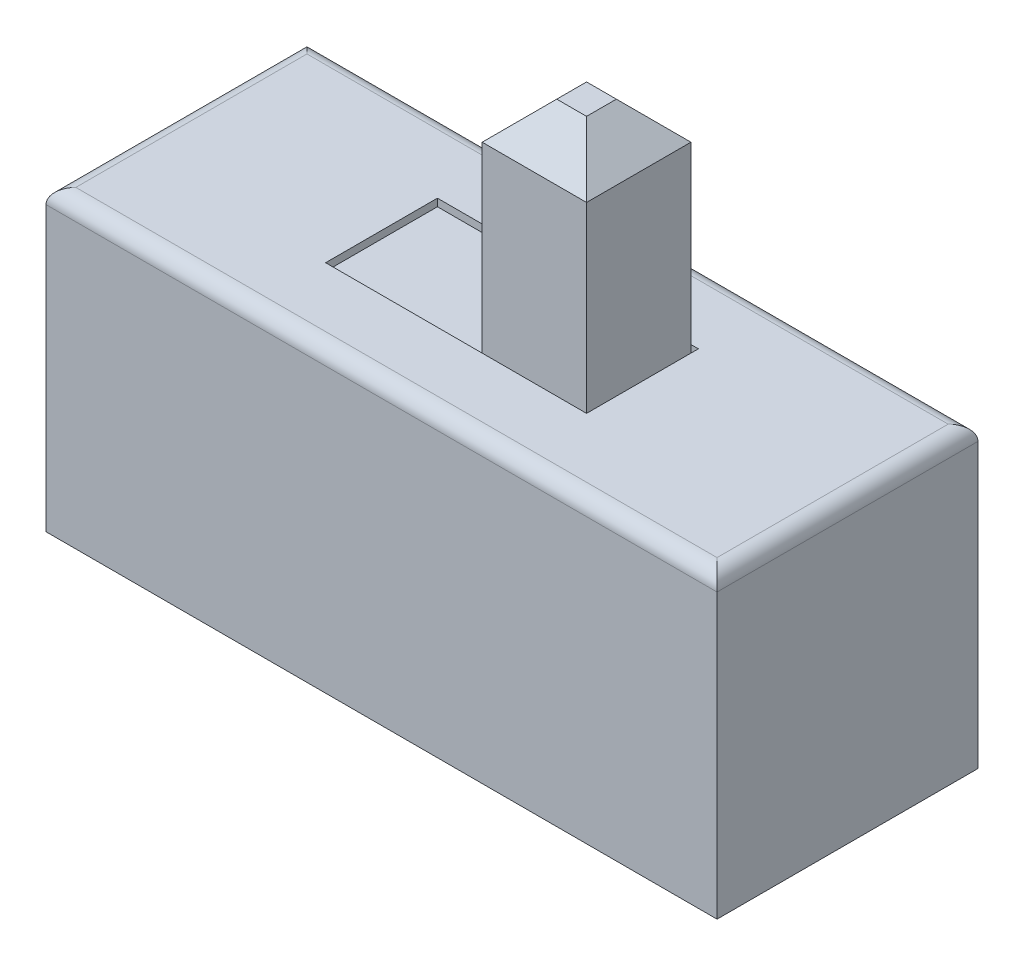
ISO-10303-21;
HEADER;
FILE_DESCRIPTION(('STEP AP214'),'2;1');
FILE_NAME('part.step','',(''),(''),'','','');
FILE_SCHEMA(('AUTOMOTIVE_DESIGN { 1 0 10303 214 1 1 1 1 }'));
ENDSEC;
DATA;
#1=APPLICATION_CONTEXT('core data for automotive mechanical design processes');
#2=APPLICATION_PROTOCOL_DEFINITION('international standard','automotive_design',2000,#1);
#3=PRODUCT_CONTEXT('',#1,'mechanical');
#4=PRODUCT('Part','Part','',(#3));
#5=PRODUCT_RELATED_PRODUCT_CATEGORY('part','',(#4));
#6=PRODUCT_DEFINITION_FORMATION('','',#4);
#7=PRODUCT_DEFINITION_CONTEXT('part definition',#1,'design');
#8=PRODUCT_DEFINITION('design','',#6,#7);
#9=PRODUCT_DEFINITION_SHAPE('','',#8);
#10=(LENGTH_UNIT() NAMED_UNIT(*) SI_UNIT(.MILLI.,.METRE.));
#11=(NAMED_UNIT(*) PLANE_ANGLE_UNIT() SI_UNIT($,.RADIAN.));
#12=(NAMED_UNIT(*) SI_UNIT($,.STERADIAN.) SOLID_ANGLE_UNIT());
#13=UNCERTAINTY_MEASURE_WITH_UNIT(LENGTH_MEASURE(1.E-05),#10,'distance_accuracy_value','');
#14=(GEOMETRIC_REPRESENTATION_CONTEXT(3) GLOBAL_UNCERTAINTY_ASSIGNED_CONTEXT((#13)) GLOBAL_UNIT_ASSIGNED_CONTEXT((#10,
#11,#12)) REPRESENTATION_CONTEXT('',''));
#15=CARTESIAN_POINT('',(0.,0.,0.));
#16=DIRECTION('',(0.,0.,1.));
#17=DIRECTION('',(1.,0.,0.));
#18=AXIS2_PLACEMENT_3D('',#15,#16,#17);
#19=CARTESIAN_POINT('',(64.5,2.,-45.));
#20=DIRECTION('',(0.,0.,1.));
#21=DIRECTION('',(1.,0.,0.));
#22=AXIS2_PLACEMENT_3D('',#19,#20,#21);
#23=PLANE('',#22);
#24=DIRECTION('',(-1.,0.,0.));
#25=VECTOR('',#24,1.);
#26=CARTESIAN_POINT('',(64.5,3.8,-45.));
#27=LINE('',#26,#25);
#28=CARTESIAN_POINT('',(69.,3.8,-45.));
#29=VERTEX_POINT('',#28);
#30=CARTESIAN_POINT('',(60.,3.8,-45.));
#31=VERTEX_POINT('',#30);
#32=EDGE_CURVE('E267',#29,#31,#27,.T.);
#33=ORIENTED_EDGE('',*,*,#32,.F.);
#34=DIRECTION('',(0.,-1.,0.));
#35=VECTOR('',#34,1.);
#36=CARTESIAN_POINT('',(69.,2.,-45.));
#37=LINE('',#36,#35);
#38=CARTESIAN_POINT('',(69.,0.,-45.));
#39=VERTEX_POINT('',#38);
#40=EDGE_CURVE('E298',#29,#39,#37,.T.);
#41=ORIENTED_EDGE('',*,*,#40,.T.);
#42=DIRECTION('',(1.,0.,0.));
#43=VECTOR('',#42,1.);
#44=CARTESIAN_POINT('',(64.5,0.,-45.));
#45=LINE('',#44,#43);
#46=CARTESIAN_POINT('',(60.,0.,-45.));
#47=VERTEX_POINT('',#46);
#48=EDGE_CURVE('E27',#47,#39,#45,.T.);
#49=ORIENTED_EDGE('',*,*,#48,.F.);
#50=DIRECTION('',(0.,-1.,0.));
#51=VECTOR('',#50,1.);
#52=CARTESIAN_POINT('',(60.,2.,-45.));
#53=LINE('',#52,#51);
#54=EDGE_CURVE('E11',#31,#47,#53,.T.);
#55=ORIENTED_EDGE('',*,*,#54,.F.);
#56=EDGE_LOOP('',(#33,#41,#49,#55));
#57=FACE_BOUND('',#56,.T.);
#58=ADVANCED_FACE('F16',(#57),#23,.F.);
#59=CARTESIAN_POINT('',(60.,2.,-43.25));
#60=DIRECTION('',(1.,0.,0.));
#61=DIRECTION('',(0.,1.,0.));
#62=AXIS2_PLACEMENT_3D('',#59,#60,#61);
#63=PLANE('',#62);
#64=DIRECTION('',(0.,0.,1.));
#65=VECTOR('',#64,1.);
#66=CARTESIAN_POINT('',(60.,3.8,-43.25));
#67=LINE('',#66,#65);
#68=CARTESIAN_POINT('',(60.,3.8,-41.5));
#69=VERTEX_POINT('',#68);
#70=EDGE_CURVE('E276',#31,#69,#67,.T.);
#71=ORIENTED_EDGE('',*,*,#70,.F.);
#72=ORIENTED_EDGE('',*,*,#54,.T.);
#73=DIRECTION('',(0.,0.,-1.));
#74=VECTOR('',#73,1.);
#75=CARTESIAN_POINT('',(60.,0.,-43.25));
#76=LINE('',#75,#74);
#77=CARTESIAN_POINT('',(60.,0.,-41.5));
#78=VERTEX_POINT('',#77);
#79=EDGE_CURVE('E120',#78,#47,#76,.T.);
#80=ORIENTED_EDGE('',*,*,#79,.F.);
#81=DIRECTION('',(0.,-1.,0.));
#82=VECTOR('',#81,1.);
#83=CARTESIAN_POINT('',(60.,2.,-41.5));
#84=LINE('',#83,#82);
#85=EDGE_CURVE('E302',#69,#78,#84,.T.);
#86=ORIENTED_EDGE('',*,*,#85,.F.);
#87=EDGE_LOOP('',(#71,#72,#80,#86));
#88=FACE_BOUND('',#87,.T.);
#89=ADVANCED_FACE('F563',(#88),#63,.F.);
#90=CARTESIAN_POINT('',(64.5,0.,-43.25));
#91=DIRECTION('',(0.,1.,0.));
#92=DIRECTION('',(1.,0.,0.));
#93=AXIS2_PLACEMENT_3D('',#90,#91,#92);
#94=PLANE('',#93);
#95=DIRECTION('',(-1.,0.,0.));
#96=VECTOR('',#95,1.);
#97=CARTESIAN_POINT('',(64.5,0.,-41.5));
#98=LINE('',#97,#96);
#99=CARTESIAN_POINT('',(69.,0.,-41.5));
#100=VERTEX_POINT('',#99);
#101=EDGE_CURVE('E309',#100,#78,#98,.T.);
#102=ORIENTED_EDGE('',*,*,#101,.T.);
#103=ORIENTED_EDGE('',*,*,#79,.T.);
#104=ORIENTED_EDGE('',*,*,#48,.T.);
#105=DIRECTION('',(0.,0.,1.));
#106=VECTOR('',#105,1.);
#107=CARTESIAN_POINT('',(69.,0.,-43.25));
#108=LINE('',#107,#106);
#109=EDGE_CURVE('E266',#39,#100,#108,.T.);
#110=ORIENTED_EDGE('',*,*,#109,.T.);
#111=EDGE_LOOP('',(#102,#103,#104,#110));
#112=FACE_BOUND('',#111,.T.);
#113=ADVANCED_FACE('F555',(#112),#94,.F.);
#114=CARTESIAN_POINT('',(64.5,3.5,-44.));
#115=DIRECTION('',(0.,0.,1.));
#116=DIRECTION('',(1.,0.,0.));
#117=AXIS2_PLACEMENT_3D('',#114,#115,#116);
#118=PLANE('',#117);
#119=DIRECTION('',(0.,-1.,0.));
#120=VECTOR('',#119,1.);
#121=CARTESIAN_POINT('',(66.25,3.5,-44.));
#122=LINE('',#121,#120);
#123=CARTESIAN_POINT('',(66.25,4.,-44.));
#124=VERTEX_POINT('',#123);
#125=CARTESIAN_POINT('',(66.25,3.9,-44.));
#126=VERTEX_POINT('',#125);
#127=EDGE_CURVE('E111',#124,#126,#122,.T.);
#128=ORIENTED_EDGE('',*,*,#127,.F.);
#129=DIRECTION('',(1.,0.,0.));
#130=VECTOR('',#129,1.);
#131=CARTESIAN_POINT('',(64.5,4.,-44.));
#132=LINE('',#131,#130);
#133=CARTESIAN_POINT('',(62.75,4.,-44.));
#134=VERTEX_POINT('',#133);
#135=EDGE_CURVE('E206',#134,#124,#132,.T.);
#136=ORIENTED_EDGE('',*,*,#135,.F.);
#137=DIRECTION('',(0.,-1.,0.));
#138=VECTOR('',#137,1.);
#139=CARTESIAN_POINT('',(62.75,3.5,-44.));
#140=LINE('',#139,#138);
#141=CARTESIAN_POINT('',(62.75,3.9,-44.));
#142=VERTEX_POINT('',#141);
#143=EDGE_CURVE('E240',#134,#142,#140,.T.);
#144=ORIENTED_EDGE('',*,*,#143,.T.);
#145=DIRECTION('',(1.,0.,0.));
#146=VECTOR('',#145,1.);
#147=CARTESIAN_POINT('',(64.5,3.9,-44.));
#148=LINE('',#147,#146);
#149=EDGE_CURVE('E241',#142,#126,#148,.T.);
#150=ORIENTED_EDGE('',*,*,#149,.T.);
#151=EDGE_LOOP('',(#128,#136,#144,#150));
#152=FACE_BOUND('',#151,.T.);
#153=ADVANCED_FACE('F553',(#152),#118,.T.);
#154=CARTESIAN_POINT('',(62.75,3.5,-43.25));
#155=DIRECTION('',(1.,0.,0.));
#156=DIRECTION('',(0.,1.,0.));
#157=AXIS2_PLACEMENT_3D('',#154,#155,#156);
#158=PLANE('',#157);
#159=ORIENTED_EDGE('',*,*,#143,.F.);
#160=DIRECTION('',(0.,0.,-1.));
#161=VECTOR('',#160,1.);
#162=CARTESIAN_POINT('',(62.75,4.,-43.25));
#163=LINE('',#162,#161);
#164=CARTESIAN_POINT('',(62.75,4.,-42.5));
#165=VERTEX_POINT('',#164);
#166=EDGE_CURVE('E214',#165,#134,#163,.T.);
#167=ORIENTED_EDGE('',*,*,#166,.F.);
#168=DIRECTION('',(0.,-1.,0.));
#169=VECTOR('',#168,1.);
#170=CARTESIAN_POINT('',(62.75,3.5,-42.5));
#171=LINE('',#170,#169);
#172=CARTESIAN_POINT('',(62.75,3.9,-42.5));
#173=VERTEX_POINT('',#172);
#174=EDGE_CURVE('E280',#165,#173,#171,.T.);
#175=ORIENTED_EDGE('',*,*,#174,.T.);
#176=DIRECTION('',(0.,0.,-1.));
#177=VECTOR('',#176,1.);
#178=CARTESIAN_POINT('',(62.75,3.9,-43.25));
#179=LINE('',#178,#177);
#180=EDGE_CURVE('E244',#173,#142,#179,.T.);
#181=ORIENTED_EDGE('',*,*,#180,.T.);
#182=EDGE_LOOP('',(#159,#167,#175,#181));
#183=FACE_BOUND('',#182,.T.);
#184=ADVANCED_FACE('F551',(#183),#158,.T.);
#185=CARTESIAN_POINT('',(64.5,3.5,-42.5));
#186=DIRECTION('',(0.,0.,-1.));
#187=DIRECTION('',(0.,-1.,0.));
#188=AXIS2_PLACEMENT_3D('',#185,#186,#187);
#189=PLANE('',#188);
#190=ORIENTED_EDGE('',*,*,#174,.F.);
#191=DIRECTION('',(-1.,0.,0.));
#192=VECTOR('',#191,1.);
#193=CARTESIAN_POINT('',(64.5,4.,-42.5));
#194=LINE('',#193,#192);
#195=CARTESIAN_POINT('',(66.25,4.,-42.5));
#196=VERTEX_POINT('',#195);
#197=EDGE_CURVE('E268',#196,#165,#194,.T.);
#198=ORIENTED_EDGE('',*,*,#197,.F.);
#199=DIRECTION('',(0.,-1.,0.));
#200=VECTOR('',#199,1.);
#201=CARTESIAN_POINT('',(66.25,3.5,-42.5));
#202=LINE('',#201,#200);
#203=CARTESIAN_POINT('',(66.25,3.9,-42.5));
#204=VERTEX_POINT('',#203);
#205=EDGE_CURVE('E281',#196,#204,#202,.T.);
#206=ORIENTED_EDGE('',*,*,#205,.T.);
#207=DIRECTION('',(-1.,0.,0.));
#208=VECTOR('',#207,1.);
#209=CARTESIAN_POINT('',(64.5,3.9,-42.5));
#210=LINE('',#209,#208);
#211=EDGE_CURVE('E297',#204,#173,#210,.T.);
#212=ORIENTED_EDGE('',*,*,#211,.T.);
#213=EDGE_LOOP('',(#190,#198,#206,#212));
#214=FACE_BOUND('',#213,.T.);
#215=ADVANCED_FACE('F547',(#214),#189,.T.);
#216=CARTESIAN_POINT('',(66.25,3.5,-43.25));
#217=DIRECTION('',(-1.,0.,0.));
#218=DIRECTION('',(0.,0.,1.));
#219=AXIS2_PLACEMENT_3D('',#216,#217,#218);
#220=PLANE('',#219);
#221=ORIENTED_EDGE('',*,*,#205,.F.);
#222=DIRECTION('',(0.,0.,1.));
#223=VECTOR('',#222,1.);
#224=CARTESIAN_POINT('',(66.25,4.,-43.25));
#225=LINE('',#224,#223);
#226=EDGE_CURVE('E218',#124,#196,#225,.T.);
#227=ORIENTED_EDGE('',*,*,#226,.F.);
#228=ORIENTED_EDGE('',*,*,#127,.T.);
#229=DIRECTION('',(0.,0.,1.));
#230=VECTOR('',#229,1.);
#231=CARTESIAN_POINT('',(66.25,3.9,-43.25));
#232=LINE('',#231,#230);
#233=EDGE_CURVE('E293',#126,#204,#232,.T.);
#234=ORIENTED_EDGE('',*,*,#233,.T.);
#235=EDGE_LOOP('',(#221,#227,#228,#234));
#236=FACE_BOUND('',#235,.T.);
#237=ADVANCED_FACE('F543',(#236),#220,.T.);
#238=CARTESIAN_POINT('',(64.5,3.9,-43.25));
#239=DIRECTION('',(0.,1.,0.));
#240=DIRECTION('',(1.,0.,0.));
#241=AXIS2_PLACEMENT_3D('',#238,#239,#240);
#242=PLANE('',#241);
#243=DIRECTION('',(0.,0.,1.));
#244=VECTOR('',#243,1.);
#245=CARTESIAN_POINT('',(66.2,3.9,-43.25));
#246=LINE('',#245,#244);
#247=CARTESIAN_POINT('',(66.2,3.9,-43.95));
#248=VERTEX_POINT('',#247);
#249=CARTESIAN_POINT('',(66.2,3.9,-42.55));
#250=VERTEX_POINT('',#249);
#251=EDGE_CURVE('E232',#248,#250,#246,.T.);
#252=ORIENTED_EDGE('',*,*,#251,.T.);
#253=DIRECTION('',(-1.,0.,0.));
#254=VECTOR('',#253,1.);
#255=CARTESIAN_POINT('',(65.,3.9,-42.55));
#256=LINE('',#255,#254);
#257=CARTESIAN_POINT('',(64.8,3.9,-42.55));
#258=VERTEX_POINT('',#257);
#259=EDGE_CURVE('E221',#250,#258,#256,.T.);
#260=ORIENTED_EDGE('',*,*,#259,.T.);
#261=DIRECTION('',(0.,0.,-1.));
#262=VECTOR('',#261,1.);
#263=CARTESIAN_POINT('',(64.8,3.9,-43.25));
#264=LINE('',#263,#262);
#265=CARTESIAN_POINT('',(64.8,3.9,-43.95));
#266=VERTEX_POINT('',#265);
#267=EDGE_CURVE('E228',#258,#266,#264,.T.);
#268=ORIENTED_EDGE('',*,*,#267,.T.);
#269=DIRECTION('',(1.,0.,0.));
#270=VECTOR('',#269,1.);
#271=CARTESIAN_POINT('',(65.,3.9,-43.95));
#272=LINE('',#271,#270);
#273=EDGE_CURVE('E245',#266,#248,#272,.T.);
#274=ORIENTED_EDGE('',*,*,#273,.T.);
#275=EDGE_LOOP('',(#252,#260,#268,#274));
#276=FACE_BOUND('',#275,.T.);
#277=ORIENTED_EDGE('',*,*,#149,.F.);
#278=ORIENTED_EDGE('',*,*,#180,.F.);
#279=ORIENTED_EDGE('',*,*,#211,.F.);
#280=ORIENTED_EDGE('',*,*,#233,.F.);
#281=EDGE_LOOP('',(#277,#278,#279,#280));
#282=FACE_BOUND('',#281,.T.);
#283=ADVANCED_FACE('F618',(#276,#282),#242,.T.);
#284=CARTESIAN_POINT('',(65.5,5.4,-43.95));
#285=DIRECTION('',(0.,0.,1.));
#286=DIRECTION('',(1.,0.,0.));
#287=AXIS2_PLACEMENT_3D('',#284,#285,#286);
#288=PLANE('',#287);
#289=DIRECTION('',(-1.,0.,0.));
#290=VECTOR('',#289,1.);
#291=CARTESIAN_POINT('',(65.5,6.4,-43.95));
#292=LINE('',#291,#290);
#293=CARTESIAN_POINT('',(66.2,6.4,-43.95));
#294=VERTEX_POINT('',#293);
#295=CARTESIAN_POINT('',(64.8,6.4,-43.95));
#296=VERTEX_POINT('',#295);
#297=EDGE_CURVE('E289',#294,#296,#292,.T.);
#298=ORIENTED_EDGE('',*,*,#297,.F.);
#299=DIRECTION('',(0.,1.,0.));
#300=VECTOR('',#299,1.);
#301=CARTESIAN_POINT('',(66.2,5.4,-43.95));
#302=LINE('',#301,#300);
#303=EDGE_CURVE('E261',#248,#294,#302,.T.);
#304=ORIENTED_EDGE('',*,*,#303,.F.);
#305=ORIENTED_EDGE('',*,*,#273,.F.);
#306=DIRECTION('',(0.,1.,0.));
#307=VECTOR('',#306,1.);
#308=CARTESIAN_POINT('',(64.8,5.4,-43.95));
#309=LINE('',#308,#307);
#310=EDGE_CURVE('E233',#266,#296,#309,.T.);
#311=ORIENTED_EDGE('',*,*,#310,.T.);
#312=EDGE_LOOP('',(#298,#304,#305,#311));
#313=FACE_BOUND('',#312,.T.);
#314=ADVANCED_FACE('F615',(#313),#288,.F.);
#315=CARTESIAN_POINT('',(66.2,5.4,-43.25));
#316=DIRECTION('',(-1.,0.,0.));
#317=DIRECTION('',(0.,0.,1.));
#318=AXIS2_PLACEMENT_3D('',#315,#316,#317);
#319=PLANE('',#318);
#320=DIRECTION('',(0.,0.,-1.));
#321=VECTOR('',#320,1.);
#322=CARTESIAN_POINT('',(66.2,6.4,-43.25));
#323=LINE('',#322,#321);
#324=CARTESIAN_POINT('',(66.2,6.4,-42.55));
#325=VERTEX_POINT('',#324);
#326=EDGE_CURVE('E284',#325,#294,#323,.T.);
#327=ORIENTED_EDGE('',*,*,#326,.F.);
#328=DIRECTION('',(0.,1.,0.));
#329=VECTOR('',#328,1.);
#330=CARTESIAN_POINT('',(66.2,5.4,-42.55));
#331=LINE('',#330,#329);
#332=EDGE_CURVE('E248',#250,#325,#331,.T.);
#333=ORIENTED_EDGE('',*,*,#332,.F.);
#334=ORIENTED_EDGE('',*,*,#251,.F.);
#335=ORIENTED_EDGE('',*,*,#303,.T.);
#336=EDGE_LOOP('',(#327,#333,#334,#335));
#337=FACE_BOUND('',#336,.T.);
#338=ADVANCED_FACE('F624',(#337),#319,.F.);
#339=CARTESIAN_POINT('',(65.5,6.9,-43.25));
#340=DIRECTION('',(0.,-1.,0.));
#341=DIRECTION('',(0.,0.,-1.));
#342=AXIS2_PLACEMENT_3D('',#339,#340,#341);
#343=PLANE('',#342);
#344=DIRECTION('',(0.,0.,-1.));
#345=VECTOR('',#344,1.);
#346=CARTESIAN_POINT('',(65.3,6.9,-43.25));
#347=LINE('',#346,#345);
#348=CARTESIAN_POINT('',(65.3,6.9,-43.05));
#349=VERTEX_POINT('',#348);
#350=CARTESIAN_POINT('',(65.3,6.9,-43.45));
#351=VERTEX_POINT('',#350);
#352=EDGE_CURVE('E196',#349,#351,#347,.T.);
#353=ORIENTED_EDGE('',*,*,#352,.F.);
#354=DIRECTION('',(-1.,0.,0.));
#355=VECTOR('',#354,1.);
#356=CARTESIAN_POINT('',(65.5,6.9,-43.05));
#357=LINE('',#356,#355);
#358=CARTESIAN_POINT('',(65.7,6.9,-43.05));
#359=VERTEX_POINT('',#358);
#360=EDGE_CURVE('E180',#359,#349,#357,.T.);
#361=ORIENTED_EDGE('',*,*,#360,.F.);
#362=DIRECTION('',(0.,0.,1.));
#363=VECTOR('',#362,1.);
#364=CARTESIAN_POINT('',(65.7,6.9,-43.25));
#365=LINE('',#364,#363);
#366=CARTESIAN_POINT('',(65.7,6.9,-43.45));
#367=VERTEX_POINT('',#366);
#368=EDGE_CURVE('E63',#367,#359,#365,.T.);
#369=ORIENTED_EDGE('',*,*,#368,.F.);
#370=DIRECTION('',(1.,0.,0.));
#371=VECTOR('',#370,1.);
#372=CARTESIAN_POINT('',(65.5,6.9,-43.45));
#373=LINE('',#372,#371);
#374=EDGE_CURVE('E199',#351,#367,#373,.T.);
#375=ORIENTED_EDGE('',*,*,#374,.F.);
#376=EDGE_LOOP('',(#353,#361,#369,#375));
#377=FACE_BOUND('',#376,.T.);
#378=ADVANCED_FACE('F201',(#377),#343,.F.);
#379=CARTESIAN_POINT('',(64.8,5.4,-43.25));
#380=DIRECTION('',(1.,0.,0.));
#381=DIRECTION('',(0.,1.,0.));
#382=AXIS2_PLACEMENT_3D('',#379,#380,#381);
#383=PLANE('',#382);
#384=DIRECTION('',(0.,0.,1.));
#385=VECTOR('',#384,1.);
#386=CARTESIAN_POINT('',(64.8,6.4,-43.25));
#387=LINE('',#386,#385);
#388=CARTESIAN_POINT('',(64.8,6.4,-42.55));
#389=VERTEX_POINT('',#388);
#390=EDGE_CURVE('E197',#296,#389,#387,.T.);
#391=ORIENTED_EDGE('',*,*,#390,.F.);
#392=ORIENTED_EDGE('',*,*,#310,.F.);
#393=ORIENTED_EDGE('',*,*,#267,.F.);
#394=DIRECTION('',(0.,1.,0.));
#395=VECTOR('',#394,1.);
#396=CARTESIAN_POINT('',(64.8,5.4,-42.55));
#397=LINE('',#396,#395);
#398=EDGE_CURVE('E80',#258,#389,#397,.T.);
#399=ORIENTED_EDGE('',*,*,#398,.T.);
#400=EDGE_LOOP('',(#391,#392,#393,#399));
#401=FACE_BOUND('',#400,.T.);
#402=ADVANCED_FACE('F603',(#401),#383,.F.);
#403=CARTESIAN_POINT('',(65.5,5.4,-42.55));
#404=DIRECTION('',(0.,0.,-1.));
#405=DIRECTION('',(0.,-1.,0.));
#406=AXIS2_PLACEMENT_3D('',#403,#404,#405);
#407=PLANE('',#406);
#408=DIRECTION('',(1.,0.,0.));
#409=VECTOR('',#408,1.);
#410=CARTESIAN_POINT('',(65.5,6.4,-42.55));
#411=LINE('',#410,#409);
#412=EDGE_CURVE('E190',#389,#325,#411,.T.);
#413=ORIENTED_EDGE('',*,*,#412,.F.);
#414=ORIENTED_EDGE('',*,*,#398,.F.);
#415=ORIENTED_EDGE('',*,*,#259,.F.);
#416=ORIENTED_EDGE('',*,*,#332,.T.);
#417=EDGE_LOOP('',(#413,#414,#415,#416));
#418=FACE_BOUND('',#417,.T.);
#419=ADVANCED_FACE('F577',(#418),#407,.F.);
#420=CARTESIAN_POINT('',(65.5,6.65,-42.8));
#421=DIRECTION('',(0.,0.70710678118655,0.707106781186545));
#422=DIRECTION('',(1.,0.,0.));
#423=AXIS2_PLACEMENT_3D('',#420,#421,#422);
#424=PLANE('',#423);
#425=ORIENTED_EDGE('',*,*,#412,.T.);
#426=DIRECTION('',(0.577350269189627,-0.577350269189623,0.577350269189627));
#427=VECTOR('',#426,1.);
#428=CARTESIAN_POINT('',(65.7,6.9,-43.05));
#429=LINE('',#428,#427);
#430=EDGE_CURVE('E187',#359,#325,#429,.T.);
#431=ORIENTED_EDGE('',*,*,#430,.F.);
#432=ORIENTED_EDGE('',*,*,#360,.T.);
#433=DIRECTION('',(-0.577350269189627,-0.577350269189623,0.577350269189627));
#434=VECTOR('',#433,1.);
#435=CARTESIAN_POINT('',(65.3,6.9,-43.05));
#436=LINE('',#435,#434);
#437=EDGE_CURVE('E184',#349,#389,#436,.T.);
#438=ORIENTED_EDGE('',*,*,#437,.T.);
#439=EDGE_LOOP('',(#425,#431,#432,#438));
#440=FACE_BOUND('',#439,.T.);
#441=ADVANCED_FACE('F183',(#440),#424,.T.);
#442=CARTESIAN_POINT('',(65.95,6.65,-43.25));
#443=DIRECTION('',(0.707106781186545,0.70710678118655,0.));
#444=DIRECTION('',(0.,0.,-1.));
#445=AXIS2_PLACEMENT_3D('',#442,#443,#444);
#446=PLANE('',#445);
#447=ORIENTED_EDGE('',*,*,#368,.T.);
#448=ORIENTED_EDGE('',*,*,#430,.T.);
#449=ORIENTED_EDGE('',*,*,#326,.T.);
#450=DIRECTION('',(0.577350269189627,-0.577350269189623,-0.577350269189627));
#451=VECTOR('',#450,1.);
#452=CARTESIAN_POINT('',(65.7,6.9,-43.45));
#453=LINE('',#452,#451);
#454=EDGE_CURVE('E258',#367,#294,#453,.T.);
#455=ORIENTED_EDGE('',*,*,#454,.F.);
#456=EDGE_LOOP('',(#447,#448,#449,#455));
#457=FACE_BOUND('',#456,.T.);
#458=ADVANCED_FACE('F587',(#457),#446,.T.);
#459=CARTESIAN_POINT('',(65.5,6.65,-43.7));
#460=DIRECTION('',(0.,0.70710678118655,-0.707106781186545));
#461=DIRECTION('',(-1.,0.,0.));
#462=AXIS2_PLACEMENT_3D('',#459,#460,#461);
#463=PLANE('',#462);
#464=ORIENTED_EDGE('',*,*,#374,.T.);
#465=ORIENTED_EDGE('',*,*,#454,.T.);
#466=ORIENTED_EDGE('',*,*,#297,.T.);
#467=DIRECTION('',(-0.577350269189627,-0.577350269189623,-0.577350269189627));
#468=VECTOR('',#467,1.);
#469=CARTESIAN_POINT('',(65.3,6.9,-43.45));
#470=LINE('',#469,#468);
#471=EDGE_CURVE('E205',#351,#296,#470,.T.);
#472=ORIENTED_EDGE('',*,*,#471,.F.);
#473=EDGE_LOOP('',(#464,#465,#466,#472));
#474=FACE_BOUND('',#473,.T.);
#475=ADVANCED_FACE('F594',(#474),#463,.T.);
#476=CARTESIAN_POINT('',(65.05,6.65,-43.25));
#477=DIRECTION('',(-0.707106781186545,0.70710678118655,0.));
#478=DIRECTION('',(0.,0.,1.));
#479=AXIS2_PLACEMENT_3D('',#476,#477,#478);
#480=PLANE('',#479);
#481=ORIENTED_EDGE('',*,*,#352,.T.);
#482=ORIENTED_EDGE('',*,*,#471,.T.);
#483=ORIENTED_EDGE('',*,*,#390,.T.);
#484=ORIENTED_EDGE('',*,*,#437,.F.);
#485=EDGE_LOOP('',(#481,#482,#483,#484));
#486=FACE_BOUND('',#485,.T.);
#487=ADVANCED_FACE('F194',(#486),#480,.T.);
#488=CARTESIAN_POINT('',(64.5,4.,-43.25));
#489=DIRECTION('',(0.,1.,0.));
#490=DIRECTION('',(1.,0.,0.));
#491=AXIS2_PLACEMENT_3D('',#488,#489,#490);
#492=PLANE('',#491);
#493=ORIENTED_EDGE('',*,*,#226,.T.);
#494=ORIENTED_EDGE('',*,*,#197,.T.);
#495=ORIENTED_EDGE('',*,*,#166,.T.);
#496=ORIENTED_EDGE('',*,*,#135,.T.);
#497=EDGE_LOOP('',(#493,#494,#495,#496));
#498=FACE_BOUND('',#497,.T.);
#499=DIRECTION('',(-1.,0.,0.));
#500=VECTOR('',#499,1.);
#501=CARTESIAN_POINT('',(64.5,4.,-41.7));
#502=LINE('',#501,#500);
#503=CARTESIAN_POINT('',(68.8,4.,-41.7));
#504=VERTEX_POINT('',#503);
#505=CARTESIAN_POINT('',(60.2,4.,-41.7));
#506=VERTEX_POINT('',#505);
#507=EDGE_CURVE('E20',#504,#506,#502,.T.);
#508=ORIENTED_EDGE('',*,*,#507,.F.);
#509=DIRECTION('',(0.,0.,1.));
#510=VECTOR('',#509,1.);
#511=CARTESIAN_POINT('',(68.8,4.,-43.25));
#512=LINE('',#511,#510);
#513=CARTESIAN_POINT('',(68.8,4.,-44.8));
#514=VERTEX_POINT('',#513);
#515=EDGE_CURVE('E227',#514,#504,#512,.T.);
#516=ORIENTED_EDGE('',*,*,#515,.F.);
#517=DIRECTION('',(1.,0.,0.));
#518=VECTOR('',#517,1.);
#519=CARTESIAN_POINT('',(64.5,4.,-44.8));
#520=LINE('',#519,#518);
#521=CARTESIAN_POINT('',(60.2,4.,-44.8));
#522=VERTEX_POINT('',#521);
#523=EDGE_CURVE('E237',#522,#514,#520,.T.);
#524=ORIENTED_EDGE('',*,*,#523,.F.);
#525=DIRECTION('',(0.,0.,-1.));
#526=VECTOR('',#525,1.);
#527=CARTESIAN_POINT('',(60.2,4.,-43.25));
#528=LINE('',#527,#526);
#529=EDGE_CURVE('E272',#506,#522,#528,.T.);
#530=ORIENTED_EDGE('',*,*,#529,.F.);
#531=EDGE_LOOP('',(#508,#516,#524,#530));
#532=FACE_BOUND('',#531,.T.);
#533=ADVANCED_FACE('F540',(#498,#532),#492,.T.);
#534=CARTESIAN_POINT('',(64.5,2.,-41.5));
#535=DIRECTION('',(0.,0.,-1.));
#536=DIRECTION('',(0.,-1.,0.));
#537=AXIS2_PLACEMENT_3D('',#534,#535,#536);
#538=PLANE('',#537);
#539=DIRECTION('',(1.,0.,0.));
#540=VECTOR('',#539,1.);
#541=CARTESIAN_POINT('',(64.5,3.8,-41.5));
#542=LINE('',#541,#540);
#543=CARTESIAN_POINT('',(69.,3.8,-41.5));
#544=VERTEX_POINT('',#543);
#545=EDGE_CURVE('E255',#69,#544,#542,.T.);
#546=ORIENTED_EDGE('',*,*,#545,.F.);
#547=ORIENTED_EDGE('',*,*,#85,.T.);
#548=ORIENTED_EDGE('',*,*,#101,.F.);
#549=DIRECTION('',(0.,-1.,0.));
#550=VECTOR('',#549,1.);
#551=CARTESIAN_POINT('',(69.,2.,-41.5));
#552=LINE('',#551,#550);
#553=EDGE_CURVE('E262',#544,#100,#552,.T.);
#554=ORIENTED_EDGE('',*,*,#553,.F.);
#555=EDGE_LOOP('',(#546,#547,#548,#554));
#556=FACE_BOUND('',#555,.T.);
#557=ADVANCED_FACE('F373',(#556),#538,.F.);
#558=CARTESIAN_POINT('',(69.,2.,-43.25));
#559=DIRECTION('',(-1.,0.,0.));
#560=DIRECTION('',(0.,0.,1.));
#561=AXIS2_PLACEMENT_3D('',#558,#559,#560);
#562=PLANE('',#561);
#563=DIRECTION('',(0.,0.,-1.));
#564=VECTOR('',#563,1.);
#565=CARTESIAN_POINT('',(69.,3.8,-43.25));
#566=LINE('',#565,#564);
#567=EDGE_CURVE('E222',#544,#29,#566,.T.);
#568=ORIENTED_EDGE('',*,*,#567,.F.);
#569=ORIENTED_EDGE('',*,*,#553,.T.);
#570=ORIENTED_EDGE('',*,*,#109,.F.);
#571=ORIENTED_EDGE('',*,*,#40,.F.);
#572=EDGE_LOOP('',(#568,#569,#570,#571));
#573=FACE_BOUND('',#572,.T.);
#574=ADVANCED_FACE('F18',(#573),#562,.F.);
#575=CARTESIAN_POINT('',(64.5,3.8,-44.8));
#576=DIRECTION('',(-1.,0.,0.));
#577=DIRECTION('',(0.,0.707106781186555,-0.70710678118654));
#578=AXIS2_PLACEMENT_3D('',#575,#576,#577);
#579=CYLINDRICAL_SURFACE('',#578,0.2);
#580=ORIENTED_EDGE('',*,*,#523,.T.);
#581=CARTESIAN_POINT('',(68.8,3.8,-44.8));
#582=DIRECTION('',(0.707106781186548,0.,0.707106781186548));
#583=DIRECTION('',(-0.707106781186548,0.,0.707106781186548));
#584=AXIS2_PLACEMENT_3D('',#581,#582,#583);
#585=ELLIPSE('',#584,0.282842712474619,0.2);
#586=EDGE_CURVE('E226',#29,#514,#585,.T.);
#587=ORIENTED_EDGE('',*,*,#586,.F.);
#588=ORIENTED_EDGE('',*,*,#32,.T.);
#589=CARTESIAN_POINT('',(60.2,3.8,-44.8));
#590=DIRECTION('',(0.707106781186548,0.,-0.707106781186548));
#591=DIRECTION('',(0.707106781186548,0.,0.707106781186548));
#592=AXIS2_PLACEMENT_3D('',#589,#590,#591);
#593=ELLIPSE('',#592,0.282842712474619,0.2);
#594=EDGE_CURVE('E275',#31,#522,#593,.T.);
#595=ORIENTED_EDGE('',*,*,#594,.T.);
#596=EDGE_LOOP('',(#580,#587,#588,#595));
#597=FACE_BOUND('',#596,.T.);
#598=ADVANCED_FACE('F581',(#597),#579,.T.);
#599=CARTESIAN_POINT('',(68.8,3.8,-43.25));
#600=DIRECTION('',(0.,0.,-1.));
#601=DIRECTION('',(0.70710678118654,0.707106781186555,0.));
#602=AXIS2_PLACEMENT_3D('',#599,#600,#601);
#603=CYLINDRICAL_SURFACE('',#602,0.2);
#604=ORIENTED_EDGE('',*,*,#515,.T.);
#605=CARTESIAN_POINT('',(68.8,3.8,-41.7));
#606=DIRECTION('',(-0.707106781186548,0.,0.707106781186548));
#607=DIRECTION('',(-0.707106781186548,0.,-0.707106781186548));
#608=AXIS2_PLACEMENT_3D('',#605,#606,#607);
#609=ELLIPSE('',#608,0.282842712474619,0.2);
#610=EDGE_CURVE('E327',#544,#504,#609,.T.);
#611=ORIENTED_EDGE('',*,*,#610,.F.);
#612=ORIENTED_EDGE('',*,*,#567,.T.);
#613=ORIENTED_EDGE('',*,*,#586,.T.);
#614=EDGE_LOOP('',(#604,#611,#612,#613));
#615=FACE_BOUND('',#614,.T.);
#616=ADVANCED_FACE('F584',(#615),#603,.T.);
#617=CARTESIAN_POINT('',(60.2,3.8,-43.25));
#618=DIRECTION('',(0.,0.,1.));
#619=DIRECTION('',(-0.70710678118654,0.707106781186555,0.));
#620=AXIS2_PLACEMENT_3D('',#617,#618,#619);
#621=CYLINDRICAL_SURFACE('',#620,0.2);
#622=ORIENTED_EDGE('',*,*,#70,.T.);
#623=CARTESIAN_POINT('',(60.2,3.8,-41.7));
#624=DIRECTION('',(0.707106781186548,0.,0.707106781186548));
#625=DIRECTION('',(-0.707106781186548,0.,0.707106781186548));
#626=AXIS2_PLACEMENT_3D('',#623,#624,#625);
#627=ELLIPSE('',#626,0.282842712474619,0.2);
#628=EDGE_CURVE('E251',#506,#69,#627,.T.);
#629=ORIENTED_EDGE('',*,*,#628,.F.);
#630=ORIENTED_EDGE('',*,*,#529,.T.);
#631=ORIENTED_EDGE('',*,*,#594,.F.);
#632=EDGE_LOOP('',(#622,#629,#630,#631));
#633=FACE_BOUND('',#632,.T.);
#634=ADVANCED_FACE('F370',(#633),#621,.T.);
#635=CARTESIAN_POINT('',(64.5,3.8,-41.7));
#636=DIRECTION('',(1.,0.,0.));
#637=DIRECTION('',(0.,0.707106781186555,0.70710678118654));
#638=AXIS2_PLACEMENT_3D('',#635,#636,#637);
#639=CYLINDRICAL_SURFACE('',#638,0.2);
#640=ORIENTED_EDGE('',*,*,#507,.T.);
#641=ORIENTED_EDGE('',*,*,#628,.T.);
#642=ORIENTED_EDGE('',*,*,#545,.T.);
#643=ORIENTED_EDGE('',*,*,#610,.T.);
#644=EDGE_LOOP('',(#640,#641,#642,#643));
#645=FACE_BOUND('',#644,.T.);
#646=ADVANCED_FACE('F376',(#645),#639,.T.);
#647=CLOSED_SHELL('',(#58,#89,#113,#153,#184,#215,#237,#283,#314,#338,#378,#402,#419,#441,#458,
#475,#487,#533,#557,#574,#598,#616,#634,#646));
#648=MANIFOLD_SOLID_BREP('B1',#647);
#649=ADVANCED_BREP_SHAPE_REPRESENTATION('',(#18,#648),#14);
#650=SHAPE_DEFINITION_REPRESENTATION(#9,#649);
ENDSEC;
END-ISO-10303-21;
